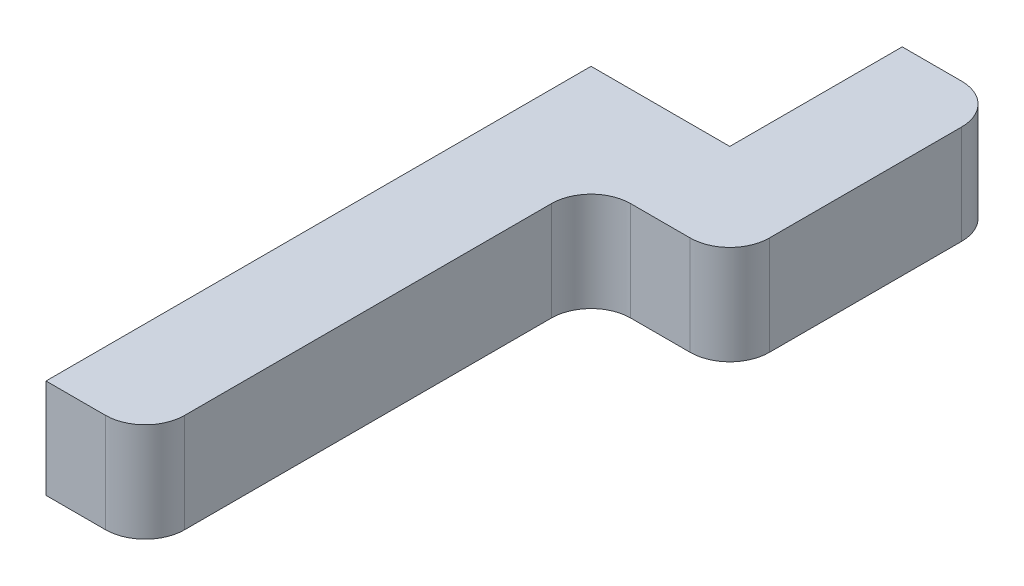
ISO-10303-21;
HEADER;
FILE_DESCRIPTION(('STEP AP214'),'2;1');
FILE_NAME('part.step','',(''),(''),'','','');
FILE_SCHEMA(('AUTOMOTIVE_DESIGN { 1 0 10303 214 1 1 1 1 }'));
ENDSEC;
DATA;
#1=APPLICATION_CONTEXT('core data for automotive mechanical design processes');
#2=APPLICATION_PROTOCOL_DEFINITION('international standard','automotive_design',2000,#1);
#3=PRODUCT_CONTEXT('',#1,'mechanical');
#4=PRODUCT('Part','Part','',(#3));
#5=PRODUCT_RELATED_PRODUCT_CATEGORY('part','',(#4));
#6=PRODUCT_DEFINITION_FORMATION('','',#4);
#7=PRODUCT_DEFINITION_CONTEXT('part definition',#1,'design');
#8=PRODUCT_DEFINITION('design','',#6,#7);
#9=PRODUCT_DEFINITION_SHAPE('','',#8);
#10=(LENGTH_UNIT() NAMED_UNIT(*) SI_UNIT(.MILLI.,.METRE.));
#11=(NAMED_UNIT(*) PLANE_ANGLE_UNIT() SI_UNIT($,.RADIAN.));
#12=(NAMED_UNIT(*) SI_UNIT($,.STERADIAN.) SOLID_ANGLE_UNIT());
#13=UNCERTAINTY_MEASURE_WITH_UNIT(LENGTH_MEASURE(1.E-05),#10,'distance_accuracy_value','');
#14=(GEOMETRIC_REPRESENTATION_CONTEXT(3) GLOBAL_UNCERTAINTY_ASSIGNED_CONTEXT((#13)) GLOBAL_UNIT_ASSIGNED_CONTEXT((#10,
#11,#12)) REPRESENTATION_CONTEXT('',''));
#15=CARTESIAN_POINT('',(0.,0.,0.));
#16=DIRECTION('',(0.,0.,1.));
#17=DIRECTION('',(1.,0.,0.));
#18=AXIS2_PLACEMENT_3D('',#15,#16,#17);
#19=CARTESIAN_POINT('',(0.,5.,-27.5));
#20=DIRECTION('',(0.,0.,1.));
#21=DIRECTION('',(1.,0.,0.));
#22=AXIS2_PLACEMENT_3D('',#19,#20,#21);
#23=PLANE('',#22);
#24=DIRECTION('',(-1.,0.,0.));
#25=VECTOR('',#24,1.);
#26=CARTESIAN_POINT('',(0.,0.,-27.5));
#27=LINE('',#26,#25);
#28=CARTESIAN_POINT('',(7.,0.,-27.5));
#29=VERTEX_POINT('',#28);
#30=CARTESIAN_POINT('',(0.,0.,-27.5));
#31=VERTEX_POINT('',#30);
#32=EDGE_CURVE('E156',#29,#31,#27,.T.);
#33=ORIENTED_EDGE('',*,*,#32,.T.);
#34=DIRECTION('',(0.,-1.,0.));
#35=VECTOR('',#34,1.);
#36=CARTESIAN_POINT('',(0.,5.,-27.5));
#37=LINE('',#36,#35);
#38=CARTESIAN_POINT('',(0.,5.,-27.5));
#39=VERTEX_POINT('',#38);
#40=EDGE_CURVE('E11',#39,#31,#37,.T.);
#41=ORIENTED_EDGE('',*,*,#40,.F.);
#42=DIRECTION('',(-1.,0.,0.));
#43=VECTOR('',#42,1.);
#44=CARTESIAN_POINT('',(0.,5.,-27.5));
#45=LINE('',#44,#43);
#46=CARTESIAN_POINT('',(7.,5.,-27.5));
#47=VERTEX_POINT('',#46);
#48=EDGE_CURVE('E178',#47,#39,#45,.T.);
#49=ORIENTED_EDGE('',*,*,#48,.F.);
#50=DIRECTION('',(0.,-1.,0.));
#51=VECTOR('',#50,1.);
#52=CARTESIAN_POINT('',(7.,5.,-27.5));
#53=LINE('',#52,#51);
#54=EDGE_CURVE('E152',#47,#29,#53,.T.);
#55=ORIENTED_EDGE('',*,*,#54,.T.);
#56=EDGE_LOOP('',(#33,#41,#49,#55));
#57=FACE_BOUND('',#56,.T.);
#58=ADVANCED_FACE('F36',(#57),#23,.F.);
#59=CARTESIAN_POINT('',(0.,5.,-27.5));
#60=DIRECTION('',(1.,0.,0.));
#61=DIRECTION('',(0.,0.,-1.));
#62=AXIS2_PLACEMENT_3D('',#59,#60,#61);
#63=PLANE('',#62);
#64=DIRECTION('',(0.,0.,1.));
#65=VECTOR('',#64,1.);
#66=CARTESIAN_POINT('',(0.,0.,-27.5));
#67=LINE('',#66,#65);
#68=CARTESIAN_POINT('',(0.,0.,0.));
#69=VERTEX_POINT('',#68);
#70=EDGE_CURVE('E159',#31,#69,#67,.T.);
#71=ORIENTED_EDGE('',*,*,#70,.T.);
#72=DIRECTION('',(0.,-1.,0.));
#73=VECTOR('',#72,1.);
#74=CARTESIAN_POINT('',(0.,5.,0.));
#75=LINE('',#74,#73);
#76=CARTESIAN_POINT('',(0.,5.,0.));
#77=VERTEX_POINT('',#76);
#78=EDGE_CURVE('E44',#77,#69,#75,.T.);
#79=ORIENTED_EDGE('',*,*,#78,.F.);
#80=DIRECTION('',(0.,0.,1.));
#81=VECTOR('',#80,1.);
#82=CARTESIAN_POINT('',(0.,5.,-27.5));
#83=LINE('',#82,#81);
#84=EDGE_CURVE('E107',#39,#77,#83,.T.);
#85=ORIENTED_EDGE('',*,*,#84,.F.);
#86=ORIENTED_EDGE('',*,*,#40,.T.);
#87=EDGE_LOOP('',(#71,#79,#85,#86));
#88=FACE_BOUND('',#87,.T.);
#89=ADVANCED_FACE('F256',(#88),#63,.F.);
#90=CARTESIAN_POINT('',(2.99999999999999,5.,0.));
#91=DIRECTION('',(0.,0.,-1.));
#92=DIRECTION('',(-1.,0.,0.));
#93=AXIS2_PLACEMENT_3D('',#90,#91,#92);
#94=PLANE('',#93);
#95=DIRECTION('',(1.,0.,0.));
#96=VECTOR('',#95,1.);
#97=CARTESIAN_POINT('',(2.99999999999999,0.,0.));
#98=LINE('',#97,#96);
#99=CARTESIAN_POINT('',(2.99999999999999,0.,0.));
#100=VERTEX_POINT('',#99);
#101=EDGE_CURVE('E161',#69,#100,#98,.T.);
#102=ORIENTED_EDGE('',*,*,#101,.T.);
#103=DIRECTION('',(0.,-1.,0.));
#104=VECTOR('',#103,1.);
#105=CARTESIAN_POINT('',(2.99999999999999,5.,0.));
#106=LINE('',#105,#104);
#107=CARTESIAN_POINT('',(2.99999999999999,5.,0.));
#108=VERTEX_POINT('',#107);
#109=EDGE_CURVE('E197',#108,#100,#106,.T.);
#110=ORIENTED_EDGE('',*,*,#109,.F.);
#111=DIRECTION('',(1.,0.,0.));
#112=VECTOR('',#111,1.);
#113=CARTESIAN_POINT('',(2.99999999999999,5.,0.));
#114=LINE('',#113,#112);
#115=EDGE_CURVE('E205',#77,#108,#114,.T.);
#116=ORIENTED_EDGE('',*,*,#115,.F.);
#117=ORIENTED_EDGE('',*,*,#78,.T.);
#118=EDGE_LOOP('',(#102,#110,#116,#117));
#119=FACE_BOUND('',#118,.T.);
#120=ADVANCED_FACE('F203',(#119),#94,.F.);
#121=CARTESIAN_POINT('',(3.,5.,-2.));
#122=DIRECTION('',(0.,-1.,0.));
#123=DIRECTION('',(0.,0.,-1.));
#124=AXIS2_PLACEMENT_3D('',#121,#122,#123);
#125=CYLINDRICAL_SURFACE('',#124,2.);
#126=CARTESIAN_POINT('',(3.,0.,-2.));
#127=DIRECTION('',(0.,1.,0.));
#128=DIRECTION('',(0.,0.,-1.));
#129=AXIS2_PLACEMENT_3D('',#126,#127,#128);
#130=CIRCLE('',#129,2.);
#131=CARTESIAN_POINT('',(5.,0.,-2.00000000000001));
#132=VERTEX_POINT('',#131);
#133=EDGE_CURVE('E163',#100,#132,#130,.T.);
#134=ORIENTED_EDGE('',*,*,#133,.T.);
#135=DIRECTION('',(0.,-1.,0.));
#136=VECTOR('',#135,1.);
#137=CARTESIAN_POINT('',(5.,5.,-2.00000000000001));
#138=LINE('',#137,#136);
#139=CARTESIAN_POINT('',(5.,5.,-2.00000000000001));
#140=VERTEX_POINT('',#139);
#141=EDGE_CURVE('E194',#140,#132,#138,.T.);
#142=ORIENTED_EDGE('',*,*,#141,.F.);
#143=CARTESIAN_POINT('',(3.,5.,-2.));
#144=DIRECTION('',(0.,1.,0.));
#145=DIRECTION('',(0.,0.,-1.));
#146=AXIS2_PLACEMENT_3D('',#143,#144,#145);
#147=CIRCLE('',#146,2.);
#148=EDGE_CURVE('E223',#108,#140,#147,.T.);
#149=ORIENTED_EDGE('',*,*,#148,.F.);
#150=ORIENTED_EDGE('',*,*,#109,.T.);
#151=EDGE_LOOP('',(#134,#142,#149,#150));
#152=FACE_BOUND('',#151,.T.);
#153=ADVANCED_FACE('F214',(#152),#125,.T.);
#154=CARTESIAN_POINT('',(5.,5.,-20.5));
#155=DIRECTION('',(-1.,0.,0.));
#156=DIRECTION('',(0.,0.,1.));
#157=AXIS2_PLACEMENT_3D('',#154,#155,#156);
#158=PLANE('',#157);
#159=DIRECTION('',(0.,0.,-1.));
#160=VECTOR('',#159,1.);
#161=CARTESIAN_POINT('',(5.,0.,-20.5));
#162=LINE('',#161,#160);
#163=CARTESIAN_POINT('',(5.,0.,-20.5));
#164=VERTEX_POINT('',#163);
#165=EDGE_CURVE('E165',#132,#164,#162,.T.);
#166=ORIENTED_EDGE('',*,*,#165,.T.);
#167=DIRECTION('',(0.,-1.,0.));
#168=VECTOR('',#167,1.);
#169=CARTESIAN_POINT('',(5.,5.,-20.5));
#170=LINE('',#169,#168);
#171=CARTESIAN_POINT('',(5.,5.,-20.5));
#172=VERTEX_POINT('',#171);
#173=EDGE_CURVE('E191',#172,#164,#170,.T.);
#174=ORIENTED_EDGE('',*,*,#173,.F.);
#175=DIRECTION('',(0.,0.,-1.));
#176=VECTOR('',#175,1.);
#177=CARTESIAN_POINT('',(5.,5.,-20.5));
#178=LINE('',#177,#176);
#179=EDGE_CURVE('E220',#140,#172,#178,.T.);
#180=ORIENTED_EDGE('',*,*,#179,.F.);
#181=ORIENTED_EDGE('',*,*,#141,.T.);
#182=EDGE_LOOP('',(#166,#174,#180,#181));
#183=FACE_BOUND('',#182,.T.);
#184=ADVANCED_FACE('F218',(#183),#158,.F.);
#185=CARTESIAN_POINT('',(7.,5.,-20.5));
#186=DIRECTION('',(0.,-1.,0.));
#187=DIRECTION('',(0.,0.,-1.));
#188=AXIS2_PLACEMENT_3D('',#185,#186,#187);
#189=CYLINDRICAL_SURFACE('',#188,2.);
#190=CARTESIAN_POINT('',(7.,0.,-20.5));
#191=DIRECTION('',(0.,-1.,0.));
#192=DIRECTION('',(0.,0.,1.));
#193=AXIS2_PLACEMENT_3D('',#190,#191,#192);
#194=CIRCLE('',#193,2.);
#195=CARTESIAN_POINT('',(7.,0.,-22.5));
#196=VERTEX_POINT('',#195);
#197=EDGE_CURVE('E167',#164,#196,#194,.T.);
#198=ORIENTED_EDGE('',*,*,#197,.T.);
#199=DIRECTION('',(0.,-1.,0.));
#200=VECTOR('',#199,1.);
#201=CARTESIAN_POINT('',(7.,5.,-22.5));
#202=LINE('',#201,#200);
#203=CARTESIAN_POINT('',(7.,5.,-22.5));
#204=VERTEX_POINT('',#203);
#205=EDGE_CURVE('E188',#204,#196,#202,.T.);
#206=ORIENTED_EDGE('',*,*,#205,.F.);
#207=CARTESIAN_POINT('',(7.,5.,-20.5));
#208=DIRECTION('',(0.,-1.,0.));
#209=DIRECTION('',(0.,0.,1.));
#210=AXIS2_PLACEMENT_3D('',#207,#208,#209);
#211=CIRCLE('',#210,2.);
#212=EDGE_CURVE('E222',#172,#204,#211,.T.);
#213=ORIENTED_EDGE('',*,*,#212,.F.);
#214=ORIENTED_EDGE('',*,*,#173,.T.);
#215=EDGE_LOOP('',(#198,#206,#213,#214));
#216=FACE_BOUND('',#215,.T.);
#217=ADVANCED_FACE('F269',(#216),#189,.F.);
#218=CARTESIAN_POINT('',(10.,5.,-22.5));
#219=DIRECTION('',(0.,0.,-1.));
#220=DIRECTION('',(-1.,0.,0.));
#221=AXIS2_PLACEMENT_3D('',#218,#219,#220);
#222=PLANE('',#221);
#223=DIRECTION('',(1.,0.,0.));
#224=VECTOR('',#223,1.);
#225=CARTESIAN_POINT('',(10.,0.,-22.5));
#226=LINE('',#225,#224);
#227=CARTESIAN_POINT('',(10.,0.,-22.5));
#228=VERTEX_POINT('',#227);
#229=EDGE_CURVE('E169',#196,#228,#226,.T.);
#230=ORIENTED_EDGE('',*,*,#229,.T.);
#231=DIRECTION('',(0.,-1.,0.));
#232=VECTOR('',#231,1.);
#233=CARTESIAN_POINT('',(10.,5.,-22.5));
#234=LINE('',#233,#232);
#235=CARTESIAN_POINT('',(10.,5.,-22.5));
#236=VERTEX_POINT('',#235);
#237=EDGE_CURVE('E185',#236,#228,#234,.T.);
#238=ORIENTED_EDGE('',*,*,#237,.F.);
#239=DIRECTION('',(1.,0.,0.));
#240=VECTOR('',#239,1.);
#241=CARTESIAN_POINT('',(10.,5.,-22.5));
#242=LINE('',#241,#240);
#243=EDGE_CURVE('E225',#204,#236,#242,.T.);
#244=ORIENTED_EDGE('',*,*,#243,.F.);
#245=ORIENTED_EDGE('',*,*,#205,.T.);
#246=EDGE_LOOP('',(#230,#238,#244,#245));
#247=FACE_BOUND('',#246,.T.);
#248=ADVANCED_FACE('F272',(#247),#222,.F.);
#249=CARTESIAN_POINT('',(10.,5.,-24.5));
#250=DIRECTION('',(0.,-1.,0.));
#251=DIRECTION('',(0.,0.,-1.));
#252=AXIS2_PLACEMENT_3D('',#249,#250,#251);
#253=CYLINDRICAL_SURFACE('',#252,2.);
#254=CARTESIAN_POINT('',(10.,0.,-24.5));
#255=DIRECTION('',(0.,1.,0.));
#256=DIRECTION('',(0.,0.,-1.));
#257=AXIS2_PLACEMENT_3D('',#254,#255,#256);
#258=CIRCLE('',#257,2.);
#259=CARTESIAN_POINT('',(12.,0.,-24.5));
#260=VERTEX_POINT('',#259);
#261=EDGE_CURVE('E171',#228,#260,#258,.T.);
#262=ORIENTED_EDGE('',*,*,#261,.T.);
#263=DIRECTION('',(0.,-1.,0.));
#264=VECTOR('',#263,1.);
#265=CARTESIAN_POINT('',(12.,5.,-24.5));
#266=LINE('',#265,#264);
#267=CARTESIAN_POINT('',(12.,5.,-24.5));
#268=VERTEX_POINT('',#267);
#269=EDGE_CURVE('E182',#268,#260,#266,.T.);
#270=ORIENTED_EDGE('',*,*,#269,.F.);
#271=CARTESIAN_POINT('',(10.,5.,-24.5));
#272=DIRECTION('',(0.,1.,0.));
#273=DIRECTION('',(0.,0.,-1.));
#274=AXIS2_PLACEMENT_3D('',#271,#272,#273);
#275=CIRCLE('',#274,2.);
#276=EDGE_CURVE('E231',#236,#268,#275,.T.);
#277=ORIENTED_EDGE('',*,*,#276,.F.);
#278=ORIENTED_EDGE('',*,*,#237,.T.);
#279=EDGE_LOOP('',(#262,#270,#277,#278));
#280=FACE_BOUND('',#279,.T.);
#281=ADVANCED_FACE('F237',(#280),#253,.T.);
#282=CARTESIAN_POINT('',(12.,5.,-34.2));
#283=DIRECTION('',(-1.,0.,0.));
#284=DIRECTION('',(0.,0.,1.));
#285=AXIS2_PLACEMENT_3D('',#282,#283,#284);
#286=PLANE('',#285);
#287=DIRECTION('',(0.,0.,-1.));
#288=VECTOR('',#287,1.);
#289=CARTESIAN_POINT('',(12.,0.,-34.2));
#290=LINE('',#289,#288);
#291=CARTESIAN_POINT('',(12.,0.,-34.2));
#292=VERTEX_POINT('',#291);
#293=EDGE_CURVE('E173',#260,#292,#290,.T.);
#294=ORIENTED_EDGE('',*,*,#293,.T.);
#295=DIRECTION('',(0.,-1.,0.));
#296=VECTOR('',#295,1.);
#297=CARTESIAN_POINT('',(12.,5.,-34.2));
#298=LINE('',#297,#296);
#299=CARTESIAN_POINT('',(12.,5.,-34.2));
#300=VERTEX_POINT('',#299);
#301=EDGE_CURVE('E147',#300,#292,#298,.T.);
#302=ORIENTED_EDGE('',*,*,#301,.F.);
#303=DIRECTION('',(0.,0.,-1.));
#304=VECTOR('',#303,1.);
#305=CARTESIAN_POINT('',(12.,5.,-34.2));
#306=LINE('',#305,#304);
#307=EDGE_CURVE('E138',#268,#300,#306,.T.);
#308=ORIENTED_EDGE('',*,*,#307,.F.);
#309=ORIENTED_EDGE('',*,*,#269,.T.);
#310=EDGE_LOOP('',(#294,#302,#308,#309));
#311=FACE_BOUND('',#310,.T.);
#312=ADVANCED_FACE('F241',(#311),#286,.F.);
#313=CARTESIAN_POINT('',(10.,5.,-34.2));
#314=DIRECTION('',(0.,-1.,0.));
#315=DIRECTION('',(0.,0.,-1.));
#316=AXIS2_PLACEMENT_3D('',#313,#314,#315);
#317=CYLINDRICAL_SURFACE('',#316,2.);
#318=CARTESIAN_POINT('',(10.,0.,-34.2));
#319=DIRECTION('',(0.,1.,0.));
#320=DIRECTION('',(0.,0.,-1.));
#321=AXIS2_PLACEMENT_3D('',#318,#319,#320);
#322=CIRCLE('',#321,2.);
#323=CARTESIAN_POINT('',(10.,0.,-36.2));
#324=VERTEX_POINT('',#323);
#325=EDGE_CURVE('E146',#292,#324,#322,.T.);
#326=ORIENTED_EDGE('',*,*,#325,.T.);
#327=DIRECTION('',(0.,-1.,0.));
#328=VECTOR('',#327,1.);
#329=CARTESIAN_POINT('',(10.,5.,-36.2));
#330=LINE('',#329,#328);
#331=CARTESIAN_POINT('',(10.,5.,-36.2));
#332=VERTEX_POINT('',#331);
#333=EDGE_CURVE('E143',#332,#324,#330,.T.);
#334=ORIENTED_EDGE('',*,*,#333,.F.);
#335=CARTESIAN_POINT('',(10.,5.,-34.2));
#336=DIRECTION('',(0.,1.,0.));
#337=DIRECTION('',(0.,0.,-1.));
#338=AXIS2_PLACEMENT_3D('',#335,#336,#337);
#339=CIRCLE('',#338,2.);
#340=EDGE_CURVE('E132',#300,#332,#339,.T.);
#341=ORIENTED_EDGE('',*,*,#340,.F.);
#342=ORIENTED_EDGE('',*,*,#301,.T.);
#343=EDGE_LOOP('',(#326,#334,#341,#342));
#344=FACE_BOUND('',#343,.T.);
#345=ADVANCED_FACE('F144',(#344),#317,.T.);
#346=CARTESIAN_POINT('',(7.,5.,-36.2));
#347=DIRECTION('',(0.,0.,1.));
#348=DIRECTION('',(1.,0.,0.));
#349=AXIS2_PLACEMENT_3D('',#346,#347,#348);
#350=PLANE('',#349);
#351=DIRECTION('',(-1.,0.,0.));
#352=VECTOR('',#351,1.);
#353=CARTESIAN_POINT('',(7.,0.,-36.2));
#354=LINE('',#353,#352);
#355=CARTESIAN_POINT('',(7.,0.,-36.2));
#356=VERTEX_POINT('',#355);
#357=EDGE_CURVE('E93',#324,#356,#354,.T.);
#358=ORIENTED_EDGE('',*,*,#357,.T.);
#359=DIRECTION('',(0.,-1.,0.));
#360=VECTOR('',#359,1.);
#361=CARTESIAN_POINT('',(7.,5.,-36.2));
#362=LINE('',#361,#360);
#363=CARTESIAN_POINT('',(7.,5.,-36.2));
#364=VERTEX_POINT('',#363);
#365=EDGE_CURVE('E148',#364,#356,#362,.T.);
#366=ORIENTED_EDGE('',*,*,#365,.F.);
#367=DIRECTION('',(-1.,0.,0.));
#368=VECTOR('',#367,1.);
#369=CARTESIAN_POINT('',(7.,5.,-36.2));
#370=LINE('',#369,#368);
#371=EDGE_CURVE('E136',#332,#364,#370,.T.);
#372=ORIENTED_EDGE('',*,*,#371,.F.);
#373=ORIENTED_EDGE('',*,*,#333,.T.);
#374=EDGE_LOOP('',(#358,#366,#372,#373));
#375=FACE_BOUND('',#374,.T.);
#376=ADVANCED_FACE('F150',(#375),#350,.F.);
#377=CARTESIAN_POINT('',(7.,5.,-27.5));
#378=DIRECTION('',(1.,0.,0.));
#379=DIRECTION('',(0.,0.,-1.));
#380=AXIS2_PLACEMENT_3D('',#377,#378,#379);
#381=PLANE('',#380);
#382=DIRECTION('',(0.,0.,1.));
#383=VECTOR('',#382,1.);
#384=CARTESIAN_POINT('',(7.,0.,-27.5));
#385=LINE('',#384,#383);
#386=EDGE_CURVE('E99',#356,#29,#385,.T.);
#387=ORIENTED_EDGE('',*,*,#386,.T.);
#388=ORIENTED_EDGE('',*,*,#54,.F.);
#389=DIRECTION('',(0.,0.,1.));
#390=VECTOR('',#389,1.);
#391=CARTESIAN_POINT('',(7.,5.,-27.5));
#392=LINE('',#391,#390);
#393=EDGE_CURVE('E52',#364,#47,#392,.T.);
#394=ORIENTED_EDGE('',*,*,#393,.F.);
#395=ORIENTED_EDGE('',*,*,#365,.T.);
#396=EDGE_LOOP('',(#387,#388,#394,#395));
#397=FACE_BOUND('',#396,.T.);
#398=ADVANCED_FACE('F245',(#397),#381,.F.);
#399=CARTESIAN_POINT('',(10.,5.,-34.2));
#400=DIRECTION('',(0.,-1.,0.));
#401=DIRECTION('',(0.,0.,-1.));
#402=AXIS2_PLACEMENT_3D('',#399,#400,#401);
#403=PLANE('',#402);
#404=ORIENTED_EDGE('',*,*,#48,.T.);
#405=ORIENTED_EDGE('',*,*,#84,.T.);
#406=ORIENTED_EDGE('',*,*,#115,.T.);
#407=ORIENTED_EDGE('',*,*,#148,.T.);
#408=ORIENTED_EDGE('',*,*,#179,.T.);
#409=ORIENTED_EDGE('',*,*,#212,.T.);
#410=ORIENTED_EDGE('',*,*,#243,.T.);
#411=ORIENTED_EDGE('',*,*,#276,.T.);
#412=ORIENTED_EDGE('',*,*,#307,.T.);
#413=ORIENTED_EDGE('',*,*,#340,.T.);
#414=ORIENTED_EDGE('',*,*,#371,.T.);
#415=ORIENTED_EDGE('',*,*,#393,.T.);
#416=EDGE_LOOP('',(#404,#405,#406,#407,#408,#409,#410,#411,#412,#413,#414,#415));
#417=FACE_BOUND('',#416,.T.);
#418=ADVANCED_FACE('F134',(#417),#403,.F.);
#419=CARTESIAN_POINT('',(10.,0.,-34.2));
#420=DIRECTION('',(0.,-1.,0.));
#421=DIRECTION('',(0.,0.,-1.));
#422=AXIS2_PLACEMENT_3D('',#419,#420,#421);
#423=PLANE('',#422);
#424=ORIENTED_EDGE('',*,*,#32,.F.);
#425=ORIENTED_EDGE('',*,*,#386,.F.);
#426=ORIENTED_EDGE('',*,*,#357,.F.);
#427=ORIENTED_EDGE('',*,*,#325,.F.);
#428=ORIENTED_EDGE('',*,*,#293,.F.);
#429=ORIENTED_EDGE('',*,*,#261,.F.);
#430=ORIENTED_EDGE('',*,*,#229,.F.);
#431=ORIENTED_EDGE('',*,*,#197,.F.);
#432=ORIENTED_EDGE('',*,*,#165,.F.);
#433=ORIENTED_EDGE('',*,*,#133,.F.);
#434=ORIENTED_EDGE('',*,*,#101,.F.);
#435=ORIENTED_EDGE('',*,*,#70,.F.);
#436=EDGE_LOOP('',(#424,#425,#426,#427,#428,#429,#430,#431,#432,#433,#434,#435));
#437=FACE_BOUND('',#436,.T.);
#438=ADVANCED_FACE('F209',(#437),#423,.T.);
#439=CLOSED_SHELL('',(#58,#89,#120,#153,#184,#217,#248,#281,#312,#345,#376,#398,#418,#438));
#440=MANIFOLD_SOLID_BREP('B2',#439);
#441=ADVANCED_BREP_SHAPE_REPRESENTATION('',(#18,#440),#14);
#442=SHAPE_DEFINITION_REPRESENTATION(#9,#441);
ENDSEC;
END-ISO-10303-21;
